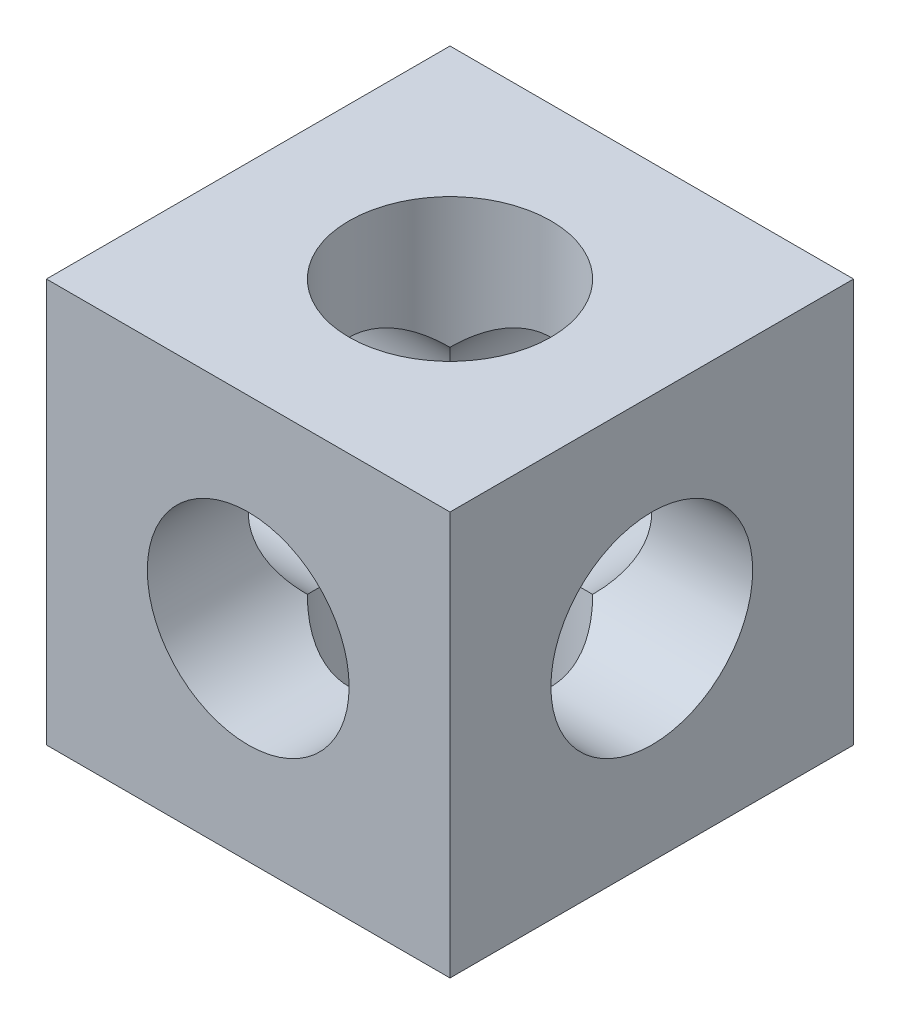
ISO-10303-21;
HEADER;
FILE_DESCRIPTION(('STEP AP214'),'2;1');
FILE_NAME('part.step','',(''),(''),'','','');
FILE_SCHEMA(('AUTOMOTIVE_DESIGN { 1 0 10303 214 1 1 1 1 }'));
ENDSEC;
DATA;
#1=APPLICATION_CONTEXT('core data for automotive mechanical design processes');
#2=APPLICATION_PROTOCOL_DEFINITION('international standard','automotive_design',2000,#1);
#3=PRODUCT_CONTEXT('',#1,'mechanical');
#4=PRODUCT('Part','Part','',(#3));
#5=PRODUCT_RELATED_PRODUCT_CATEGORY('part','',(#4));
#6=PRODUCT_DEFINITION_FORMATION('','',#4);
#7=PRODUCT_DEFINITION_CONTEXT('part definition',#1,'design');
#8=PRODUCT_DEFINITION('design','',#6,#7);
#9=PRODUCT_DEFINITION_SHAPE('','',#8);
#10=(LENGTH_UNIT() NAMED_UNIT(*) SI_UNIT(.MILLI.,.METRE.));
#11=(NAMED_UNIT(*) PLANE_ANGLE_UNIT() SI_UNIT($,.RADIAN.));
#12=(NAMED_UNIT(*) SI_UNIT($,.STERADIAN.) SOLID_ANGLE_UNIT());
#13=UNCERTAINTY_MEASURE_WITH_UNIT(LENGTH_MEASURE(1.E-05),#10,'distance_accuracy_value','');
#14=(GEOMETRIC_REPRESENTATION_CONTEXT(3) GLOBAL_UNCERTAINTY_ASSIGNED_CONTEXT((#13)) GLOBAL_UNIT_ASSIGNED_CONTEXT((#10,
#11,#12)) REPRESENTATION_CONTEXT('',''));
#15=CARTESIAN_POINT('',(0.,0.,0.));
#16=DIRECTION('',(0.,0.,1.));
#17=DIRECTION('',(1.,0.,0.));
#18=AXIS2_PLACEMENT_3D('',#15,#16,#17);
#19=CARTESIAN_POINT('',(0.,0.,0.));
#20=DIRECTION('',(0.,0.,1.));
#21=DIRECTION('',(1.,0.,0.));
#22=AXIS2_PLACEMENT_3D('',#19,#20,#21);
#23=CYLINDRICAL_SURFACE('',#22,1.5);
#24=CARTESIAN_POINT('',(0.,0.,6.));
#25=DIRECTION('',(0.,0.,1.));
#26=DIRECTION('',(1.,0.,0.));
#27=AXIS2_PLACEMENT_3D('',#24,#25,#26);
#28=CIRCLE('',#27,1.5);
#29=CARTESIAN_POINT('',(1.5,0.,6.));
#30=VERTEX_POINT('',#29);
#31=EDGE_CURVE('E179',#30,#30,#28,.T.);
#32=ORIENTED_EDGE('',*,*,#31,.T.);
#33=EDGE_LOOP('',(#32));
#34=FACE_BOUND('',#33,.T.);
#35=CARTESIAN_POINT('',(0.,0.,3.));
#36=DIRECTION('',(-0.707106781186547,0.,0.707106781186547));
#37=DIRECTION('',(0.707106781186547,0.,0.707106781186547));
#38=AXIS2_PLACEMENT_3D('',#35,#36,#37);
#39=ELLIPSE('',#38,2.12132034355964,1.5);
#40=CARTESIAN_POINT('',(1.06066017177982,1.06066017177982,4.06066017177982));
#41=VERTEX_POINT('',#40);
#42=CARTESIAN_POINT('',(1.06066017177982,-1.06066017177982,4.06066017177982));
#43=VERTEX_POINT('',#42);
#44=EDGE_CURVE('E119',#41,#43,#39,.F.);
#45=ORIENTED_EDGE('',*,*,#44,.T.);
#46=CARTESIAN_POINT('',(0.,0.,3.));
#47=DIRECTION('',(0.,0.707106781186547,0.707106781186547));
#48=DIRECTION('',(0.,-0.707106781186547,0.707106781186547));
#49=AXIS2_PLACEMENT_3D('',#46,#47,#48);
#50=ELLIPSE('',#49,2.12132034355964,1.5);
#51=CARTESIAN_POINT('',(-1.06066017177982,-1.06066017177982,4.06066017177982));
#52=VERTEX_POINT('',#51);
#53=EDGE_CURVE('E107',#43,#52,#50,.F.);
#54=ORIENTED_EDGE('',*,*,#53,.T.);
#55=CARTESIAN_POINT('',(0.,0.,3.));
#56=DIRECTION('',(0.707106781186547,0.,0.707106781186547));
#57=DIRECTION('',(-0.707106781186547,0.,0.707106781186547));
#58=AXIS2_PLACEMENT_3D('',#55,#56,#57);
#59=ELLIPSE('',#58,2.12132034355964,1.5);
#60=CARTESIAN_POINT('',(-1.06066017177982,1.06066017177982,4.06066017177982));
#61=VERTEX_POINT('',#60);
#62=EDGE_CURVE('E114',#52,#61,#59,.F.);
#63=ORIENTED_EDGE('',*,*,#62,.T.);
#64=CARTESIAN_POINT('',(0.,0.,3.));
#65=DIRECTION('',(0.,-0.707106781186547,0.707106781186547));
#66=DIRECTION('',(0.,0.707106781186547,0.707106781186547));
#67=AXIS2_PLACEMENT_3D('',#64,#65,#66);
#68=ELLIPSE('',#67,2.12132034355964,1.5);
#69=EDGE_CURVE('E59',#61,#41,#68,.F.);
#70=ORIENTED_EDGE('',*,*,#69,.T.);
#71=EDGE_LOOP('',(#45,#54,#63,#70));
#72=FACE_BOUND('',#71,.T.);
#73=ADVANCED_FACE('F43',(#34,#72),#23,.F.);
#74=CARTESIAN_POINT('',(3.,3.,6.));
#75=DIRECTION('',(-1.,0.,0.));
#76=DIRECTION('',(0.,0.,1.));
#77=AXIS2_PLACEMENT_3D('',#74,#75,#76);
#78=PLANE('',#77);
#79=CARTESIAN_POINT('',(3.,0.,3.));
#80=DIRECTION('',(1.,0.,0.));
#81=DIRECTION('',(0.,0.,-1.));
#82=AXIS2_PLACEMENT_3D('',#79,#80,#81);
#83=CIRCLE('',#82,1.5);
#84=CARTESIAN_POINT('',(3.,0.,1.5));
#85=VERTEX_POINT('',#84);
#86=EDGE_CURVE('E187',#85,#85,#83,.T.);
#87=ORIENTED_EDGE('',*,*,#86,.F.);
#88=EDGE_LOOP('',(#87));
#89=FACE_BOUND('',#88,.T.);
#90=DIRECTION('',(0.,1.,0.));
#91=VECTOR('',#90,1.);
#92=CARTESIAN_POINT('',(3.,3.,0.));
#93=LINE('',#92,#91);
#94=CARTESIAN_POINT('',(3.,-3.,0.));
#95=VERTEX_POINT('',#94);
#96=CARTESIAN_POINT('',(3.,3.,0.));
#97=VERTEX_POINT('',#96);
#98=EDGE_CURVE('E163',#95,#97,#93,.T.);
#99=ORIENTED_EDGE('',*,*,#98,.T.);
#100=DIRECTION('',(0.,0.,-1.));
#101=VECTOR('',#100,1.);
#102=CARTESIAN_POINT('',(3.,3.,6.));
#103=LINE('',#102,#101);
#104=CARTESIAN_POINT('',(3.,3.,6.));
#105=VERTEX_POINT('',#104);
#106=EDGE_CURVE('E136',#105,#97,#103,.T.);
#107=ORIENTED_EDGE('',*,*,#106,.F.);
#108=DIRECTION('',(0.,1.,0.));
#109=VECTOR('',#108,1.);
#110=CARTESIAN_POINT('',(3.,3.,6.));
#111=LINE('',#110,#109);
#112=CARTESIAN_POINT('',(3.,-3.,6.));
#113=VERTEX_POINT('',#112);
#114=EDGE_CURVE('E156',#113,#105,#111,.T.);
#115=ORIENTED_EDGE('',*,*,#114,.F.);
#116=DIRECTION('',(0.,0.,-1.));
#117=VECTOR('',#116,1.);
#118=CARTESIAN_POINT('',(3.,-3.,6.));
#119=LINE('',#118,#117);
#120=EDGE_CURVE('E148',#113,#95,#119,.T.);
#121=ORIENTED_EDGE('',*,*,#120,.T.);
#122=EDGE_LOOP('',(#99,#107,#115,#121));
#123=FACE_BOUND('',#122,.T.);
#124=ADVANCED_FACE('F45',(#89,#123),#78,.F.);
#125=CARTESIAN_POINT('',(-3.,3.,6.));
#126=DIRECTION('',(0.,-1.,0.));
#127=DIRECTION('',(0.,0.,-1.));
#128=AXIS2_PLACEMENT_3D('',#125,#126,#127);
#129=PLANE('',#128);
#130=CARTESIAN_POINT('',(0.,3.,3.));
#131=DIRECTION('',(0.,1.,0.));
#132=DIRECTION('',(0.,0.,1.));
#133=AXIS2_PLACEMENT_3D('',#130,#131,#132);
#134=CIRCLE('',#133,1.5);
#135=CARTESIAN_POINT('',(0.,3.,4.5));
#136=VERTEX_POINT('',#135);
#137=EDGE_CURVE('E209',#136,#136,#134,.T.);
#138=ORIENTED_EDGE('',*,*,#137,.F.);
#139=EDGE_LOOP('',(#138));
#140=FACE_BOUND('',#139,.T.);
#141=DIRECTION('',(-1.,0.,0.));
#142=VECTOR('',#141,1.);
#143=CARTESIAN_POINT('',(-3.,3.,0.));
#144=LINE('',#143,#142);
#145=CARTESIAN_POINT('',(-3.,3.,0.));
#146=VERTEX_POINT('',#145);
#147=EDGE_CURVE('E160',#97,#146,#144,.T.);
#148=ORIENTED_EDGE('',*,*,#147,.T.);
#149=DIRECTION('',(0.,0.,-1.));
#150=VECTOR('',#149,1.);
#151=CARTESIAN_POINT('',(-3.,3.,6.));
#152=LINE('',#151,#150);
#153=CARTESIAN_POINT('',(-3.,3.,6.));
#154=VERTEX_POINT('',#153);
#155=EDGE_CURVE('E140',#154,#146,#152,.T.);
#156=ORIENTED_EDGE('',*,*,#155,.F.);
#157=DIRECTION('',(-1.,0.,0.));
#158=VECTOR('',#157,1.);
#159=CARTESIAN_POINT('',(-3.,3.,6.));
#160=LINE('',#159,#158);
#161=EDGE_CURVE('E173',#105,#154,#160,.T.);
#162=ORIENTED_EDGE('',*,*,#161,.F.);
#163=ORIENTED_EDGE('',*,*,#106,.T.);
#164=EDGE_LOOP('',(#148,#156,#162,#163));
#165=FACE_BOUND('',#164,.T.);
#166=ADVANCED_FACE('F238',(#140,#165),#129,.F.);
#167=CARTESIAN_POINT('',(-3.,3.,6.));
#168=DIRECTION('',(1.,0.,0.));
#169=DIRECTION('',(0.,0.,-1.));
#170=AXIS2_PLACEMENT_3D('',#167,#168,#169);
#171=PLANE('',#170);
#172=CARTESIAN_POINT('',(-3.,0.,3.));
#173=DIRECTION('',(1.,0.,0.));
#174=DIRECTION('',(0.,0.,-1.));
#175=AXIS2_PLACEMENT_3D('',#172,#173,#174);
#176=CIRCLE('',#175,1.5);
#177=CARTESIAN_POINT('',(-3.,0.,1.5));
#178=VERTEX_POINT('',#177);
#179=EDGE_CURVE('E183',#178,#178,#176,.T.);
#180=ORIENTED_EDGE('',*,*,#179,.T.);
#181=EDGE_LOOP('',(#180));
#182=FACE_BOUND('',#181,.T.);
#183=DIRECTION('',(0.,-1.,0.));
#184=VECTOR('',#183,1.);
#185=CARTESIAN_POINT('',(-3.,3.,0.));
#186=LINE('',#185,#184);
#187=CARTESIAN_POINT('',(-3.,-3.,0.));
#188=VERTEX_POINT('',#187);
#189=EDGE_CURVE('E157',#146,#188,#186,.T.);
#190=ORIENTED_EDGE('',*,*,#189,.T.);
#191=DIRECTION('',(0.,0.,-1.));
#192=VECTOR('',#191,1.);
#193=CARTESIAN_POINT('',(-3.,-3.,6.));
#194=LINE('',#193,#192);
#195=CARTESIAN_POINT('',(-3.,-3.,6.));
#196=VERTEX_POINT('',#195);
#197=EDGE_CURVE('E144',#196,#188,#194,.T.);
#198=ORIENTED_EDGE('',*,*,#197,.F.);
#199=DIRECTION('',(0.,-1.,0.));
#200=VECTOR('',#199,1.);
#201=CARTESIAN_POINT('',(-3.,3.,6.));
#202=LINE('',#201,#200);
#203=EDGE_CURVE('E170',#154,#196,#202,.T.);
#204=ORIENTED_EDGE('',*,*,#203,.F.);
#205=ORIENTED_EDGE('',*,*,#155,.T.);
#206=EDGE_LOOP('',(#190,#198,#204,#205));
#207=FACE_BOUND('',#206,.T.);
#208=ADVANCED_FACE('F267',(#182,#207),#171,.F.);
#209=CARTESIAN_POINT('',(-3.,-3.,6.));
#210=DIRECTION('',(0.,1.,0.));
#211=DIRECTION('',(0.,0.,1.));
#212=AXIS2_PLACEMENT_3D('',#209,#210,#211);
#213=PLANE('',#212);
#214=CARTESIAN_POINT('',(0.,-3.,3.));
#215=DIRECTION('',(0.,1.,0.));
#216=DIRECTION('',(0.,0.,1.));
#217=AXIS2_PLACEMENT_3D('',#214,#215,#216);
#218=CIRCLE('',#217,1.5);
#219=CARTESIAN_POINT('',(0.,-3.,4.5));
#220=VERTEX_POINT('',#219);
#221=EDGE_CURVE('E208',#220,#220,#218,.T.);
#222=ORIENTED_EDGE('',*,*,#221,.T.);
#223=EDGE_LOOP('',(#222));
#224=FACE_BOUND('',#223,.T.);
#225=DIRECTION('',(1.,0.,0.));
#226=VECTOR('',#225,1.);
#227=CARTESIAN_POINT('',(-3.,-3.,0.));
#228=LINE('',#227,#226);
#229=EDGE_CURVE('E153',#188,#95,#228,.T.);
#230=ORIENTED_EDGE('',*,*,#229,.T.);
#231=ORIENTED_EDGE('',*,*,#120,.F.);
#232=DIRECTION('',(1.,0.,0.));
#233=VECTOR('',#232,1.);
#234=CARTESIAN_POINT('',(-3.,-3.,6.));
#235=LINE('',#234,#233);
#236=EDGE_CURVE('E152',#196,#113,#235,.T.);
#237=ORIENTED_EDGE('',*,*,#236,.F.);
#238=ORIENTED_EDGE('',*,*,#197,.T.);
#239=EDGE_LOOP('',(#230,#231,#237,#238));
#240=FACE_BOUND('',#239,.T.);
#241=ADVANCED_FACE('F217',(#224,#240),#213,.F.);
#242=CARTESIAN_POINT('',(0.,0.,6.));
#243=DIRECTION('',(0.,0.,1.));
#244=DIRECTION('',(1.,0.,0.));
#245=AXIS2_PLACEMENT_3D('',#242,#243,#244);
#246=PLANE('',#245);
#247=ORIENTED_EDGE('',*,*,#31,.F.);
#248=EDGE_LOOP('',(#247));
#249=FACE_BOUND('',#248,.T.);
#250=ORIENTED_EDGE('',*,*,#114,.T.);
#251=ORIENTED_EDGE('',*,*,#161,.T.);
#252=ORIENTED_EDGE('',*,*,#203,.T.);
#253=ORIENTED_EDGE('',*,*,#236,.T.);
#254=EDGE_LOOP('',(#250,#251,#252,#253));
#255=FACE_BOUND('',#254,.T.);
#256=ADVANCED_FACE('F249',(#249,#255),#246,.T.);
#257=CARTESIAN_POINT('',(0.,0.,0.));
#258=DIRECTION('',(0.,0.,1.));
#259=DIRECTION('',(1.,0.,0.));
#260=AXIS2_PLACEMENT_3D('',#257,#258,#259);
#261=PLANE('',#260);
#262=CARTESIAN_POINT('',(0.,0.,0.));
#263=DIRECTION('',(0.,0.,1.));
#264=DIRECTION('',(1.,0.,0.));
#265=AXIS2_PLACEMENT_3D('',#262,#263,#264);
#266=CIRCLE('',#265,1.5);
#267=CARTESIAN_POINT('',(1.5,0.,0.));
#268=VERTEX_POINT('',#267);
#269=EDGE_CURVE('E167',#268,#268,#266,.T.);
#270=ORIENTED_EDGE('',*,*,#269,.T.);
#271=EDGE_LOOP('',(#270));
#272=FACE_BOUND('',#271,.T.);
#273=ORIENTED_EDGE('',*,*,#98,.F.);
#274=ORIENTED_EDGE('',*,*,#229,.F.);
#275=ORIENTED_EDGE('',*,*,#189,.F.);
#276=ORIENTED_EDGE('',*,*,#147,.F.);
#277=EDGE_LOOP('',(#273,#274,#275,#276));
#278=FACE_BOUND('',#277,.T.);
#279=ADVANCED_FACE('F242',(#272,#278),#261,.F.);
#280=CARTESIAN_POINT('',(0.,0.,3.));
#281=DIRECTION('',(0.707106781186547,0.,0.707106781186547));
#282=DIRECTION('',(-0.707106781186547,0.,0.707106781186547));
#283=AXIS2_PLACEMENT_3D('',#280,#281,#282);
#284=ELLIPSE('',#283,2.12132034355964,1.5);
#285=CARTESIAN_POINT('',(1.06066017177982,-1.06066017177982,1.93933982822018));
#286=VERTEX_POINT('',#285);
#287=CARTESIAN_POINT('',(1.06066017177982,1.06066017177982,1.93933982822018));
#288=VERTEX_POINT('',#287);
#289=EDGE_CURVE('E125',#286,#288,#284,.T.);
#290=ORIENTED_EDGE('',*,*,#289,.T.);
#291=CARTESIAN_POINT('',(0.,0.,3.));
#292=DIRECTION('',(0.,0.707106781186547,0.707106781186547));
#293=DIRECTION('',(0.,-0.707106781186547,0.707106781186547));
#294=AXIS2_PLACEMENT_3D('',#291,#292,#293);
#295=ELLIPSE('',#294,2.12132034355964,1.5);
#296=CARTESIAN_POINT('',(-1.06066017177982,1.06066017177982,1.93933982822018));
#297=VERTEX_POINT('',#296);
#298=EDGE_CURVE('E200',#288,#297,#295,.T.);
#299=ORIENTED_EDGE('',*,*,#298,.T.);
#300=CARTESIAN_POINT('',(0.,0.,3.));
#301=DIRECTION('',(-0.707106781186547,0.,0.707106781186547));
#302=DIRECTION('',(0.707106781186547,0.,0.707106781186547));
#303=AXIS2_PLACEMENT_3D('',#300,#301,#302);
#304=ELLIPSE('',#303,2.12132034355964,1.5);
#305=CARTESIAN_POINT('',(-1.06066017177982,-1.06066017177982,1.93933982822018));
#306=VERTEX_POINT('',#305);
#307=EDGE_CURVE('E129',#297,#306,#304,.T.);
#308=ORIENTED_EDGE('',*,*,#307,.T.);
#309=CARTESIAN_POINT('',(0.,0.,3.));
#310=DIRECTION('',(0.,-0.707106781186547,0.707106781186547));
#311=DIRECTION('',(0.,0.707106781186547,0.707106781186547));
#312=AXIS2_PLACEMENT_3D('',#309,#310,#311);
#313=ELLIPSE('',#312,2.12132034355964,1.5);
#314=EDGE_CURVE('E66',#306,#286,#313,.T.);
#315=ORIENTED_EDGE('',*,*,#314,.T.);
#316=EDGE_LOOP('',(#290,#299,#308,#315));
#317=FACE_BOUND('',#316,.T.);
#318=ORIENTED_EDGE('',*,*,#269,.F.);
#319=EDGE_LOOP('',(#318));
#320=FACE_BOUND('',#319,.T.);
#321=ADVANCED_FACE('F234',(#317,#320),#23,.F.);
#322=CARTESIAN_POINT('',(-3.,0.,3.));
#323=DIRECTION('',(1.,0.,0.));
#324=DIRECTION('',(0.,0.,-1.));
#325=AXIS2_PLACEMENT_3D('',#322,#323,#324);
#326=CYLINDRICAL_SURFACE('',#325,1.5);
#327=ORIENTED_EDGE('',*,*,#86,.T.);
#328=EDGE_LOOP('',(#327));
#329=FACE_BOUND('',#328,.T.);
#330=ORIENTED_EDGE('',*,*,#289,.F.);
#331=CARTESIAN_POINT('',(0.,0.,3.));
#332=DIRECTION('',(0.707106781186547,0.707106781186547,0.));
#333=DIRECTION('',(0.707106781186547,-0.707106781186547,0.));
#334=AXIS2_PLACEMENT_3D('',#331,#332,#333);
#335=ELLIPSE('',#334,2.12132034355964,1.5);
#336=EDGE_CURVE('E121',#286,#43,#335,.F.);
#337=ORIENTED_EDGE('',*,*,#336,.T.);
#338=ORIENTED_EDGE('',*,*,#44,.F.);
#339=CARTESIAN_POINT('',(0.,0.,3.));
#340=DIRECTION('',(0.707106781186547,-0.707106781186547,0.));
#341=DIRECTION('',(0.707106781186547,0.707106781186547,0.));
#342=AXIS2_PLACEMENT_3D('',#339,#340,#341);
#343=ELLIPSE('',#342,2.12132034355964,1.5);
#344=EDGE_CURVE('E191',#41,#288,#343,.F.);
#345=ORIENTED_EDGE('',*,*,#344,.T.);
#346=EDGE_LOOP('',(#330,#337,#338,#345));
#347=FACE_BOUND('',#346,.T.);
#348=ADVANCED_FACE('F228',(#329,#347),#326,.F.);
#349=ORIENTED_EDGE('',*,*,#179,.F.);
#350=EDGE_LOOP('',(#349));
#351=FACE_BOUND('',#350,.T.);
#352=ORIENTED_EDGE('',*,*,#307,.F.);
#353=CARTESIAN_POINT('',(0.,0.,3.));
#354=DIRECTION('',(0.707106781186547,0.707106781186547,0.));
#355=DIRECTION('',(0.707106781186547,-0.707106781186547,0.));
#356=AXIS2_PLACEMENT_3D('',#353,#354,#355);
#357=ELLIPSE('',#356,2.12132034355964,1.5);
#358=EDGE_CURVE('E11',#297,#61,#357,.T.);
#359=ORIENTED_EDGE('',*,*,#358,.T.);
#360=ORIENTED_EDGE('',*,*,#62,.F.);
#361=CARTESIAN_POINT('',(0.,0.,3.));
#362=DIRECTION('',(0.707106781186547,-0.707106781186547,0.));
#363=DIRECTION('',(0.707106781186547,0.707106781186547,0.));
#364=AXIS2_PLACEMENT_3D('',#361,#362,#363);
#365=ELLIPSE('',#364,2.12132034355964,1.5);
#366=EDGE_CURVE('E52',#52,#306,#365,.T.);
#367=ORIENTED_EDGE('',*,*,#366,.T.);
#368=EDGE_LOOP('',(#352,#359,#360,#367));
#369=FACE_BOUND('',#368,.T.);
#370=ADVANCED_FACE('F123',(#351,#369),#326,.F.);
#371=CARTESIAN_POINT('',(0.,-3.,3.));
#372=DIRECTION('',(0.,1.,0.));
#373=DIRECTION('',(0.,0.,1.));
#374=AXIS2_PLACEMENT_3D('',#371,#372,#373);
#375=CYLINDRICAL_SURFACE('',#374,1.5);
#376=ORIENTED_EDGE('',*,*,#221,.F.);
#377=EDGE_LOOP('',(#376));
#378=FACE_BOUND('',#377,.T.);
#379=ORIENTED_EDGE('',*,*,#314,.F.);
#380=ORIENTED_EDGE('',*,*,#366,.F.);
#381=ORIENTED_EDGE('',*,*,#53,.F.);
#382=ORIENTED_EDGE('',*,*,#336,.F.);
#383=EDGE_LOOP('',(#379,#380,#381,#382));
#384=FACE_BOUND('',#383,.T.);
#385=ADVANCED_FACE('F106',(#378,#384),#375,.F.);
#386=ORIENTED_EDGE('',*,*,#137,.T.);
#387=EDGE_LOOP('',(#386));
#388=FACE_BOUND('',#387,.T.);
#389=ORIENTED_EDGE('',*,*,#69,.F.);
#390=ORIENTED_EDGE('',*,*,#358,.F.);
#391=ORIENTED_EDGE('',*,*,#298,.F.);
#392=ORIENTED_EDGE('',*,*,#344,.F.);
#393=EDGE_LOOP('',(#389,#390,#391,#392));
#394=FACE_BOUND('',#393,.T.);
#395=ADVANCED_FACE('F221',(#388,#394),#375,.F.);
#396=CLOSED_SHELL('',(#73,#124,#166,#208,#241,#256,#279,#321,#348,#370,#385,#395));
#397=MANIFOLD_SOLID_BREP('B2',#396);
#398=ADVANCED_BREP_SHAPE_REPRESENTATION('',(#18,#397),#14);
#399=SHAPE_DEFINITION_REPRESENTATION(#9,#398);
ENDSEC;
END-ISO-10303-21;
